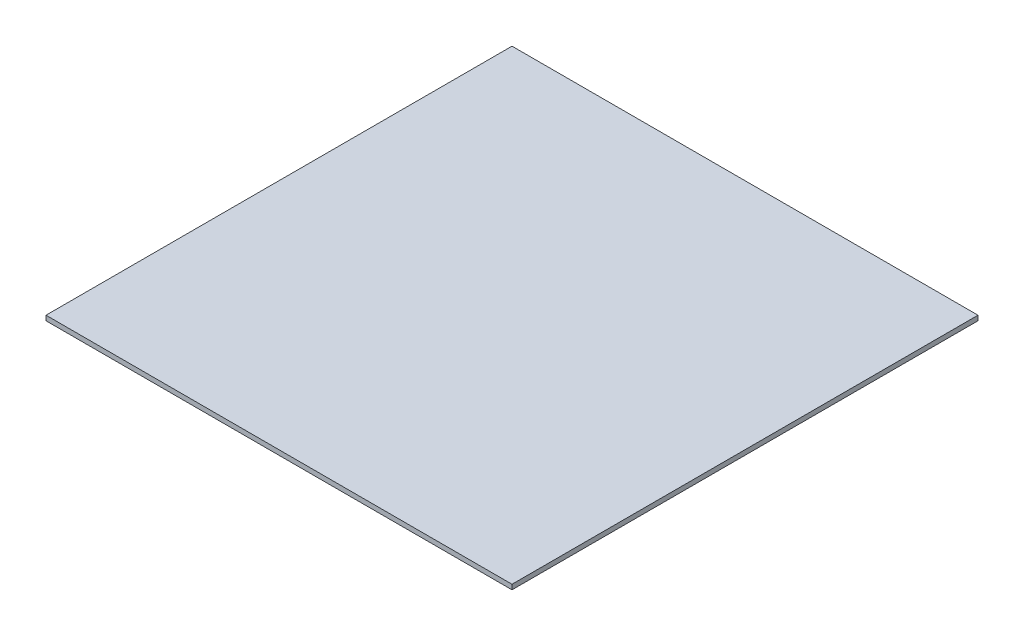
ISO-10303-21;
HEADER;
FILE_DESCRIPTION(('STEP AP214'),'2;1');
FILE_NAME('part.step','',(''),(''),'','','');
FILE_SCHEMA(('AUTOMOTIVE_DESIGN { 1 0 10303 214 1 1 1 1 }'));
ENDSEC;
DATA;
#1=APPLICATION_CONTEXT('core data for automotive mechanical design processes');
#2=APPLICATION_PROTOCOL_DEFINITION('international standard','automotive_design',2000,#1);
#3=PRODUCT_CONTEXT('',#1,'mechanical');
#4=PRODUCT('Part','Part','',(#3));
#5=PRODUCT_RELATED_PRODUCT_CATEGORY('part','',(#4));
#6=PRODUCT_DEFINITION_FORMATION('','',#4);
#7=PRODUCT_DEFINITION_CONTEXT('part definition',#1,'design');
#8=PRODUCT_DEFINITION('design','',#6,#7);
#9=PRODUCT_DEFINITION_SHAPE('','',#8);
#10=(LENGTH_UNIT() NAMED_UNIT(*) SI_UNIT(.MILLI.,.METRE.));
#11=(NAMED_UNIT(*) PLANE_ANGLE_UNIT() SI_UNIT($,.RADIAN.));
#12=(NAMED_UNIT(*) SI_UNIT($,.STERADIAN.) SOLID_ANGLE_UNIT());
#13=UNCERTAINTY_MEASURE_WITH_UNIT(LENGTH_MEASURE(1.E-05),#10,'distance_accuracy_value','');
#14=(GEOMETRIC_REPRESENTATION_CONTEXT(3) GLOBAL_UNCERTAINTY_ASSIGNED_CONTEXT((#13)) GLOBAL_UNIT_ASSIGNED_CONTEXT((#10,
#11,#12)) REPRESENTATION_CONTEXT('',''));
#15=CARTESIAN_POINT('',(0.,0.,0.));
#16=DIRECTION('',(0.,0.,1.));
#17=DIRECTION('',(1.,0.,0.));
#18=AXIS2_PLACEMENT_3D('',#15,#16,#17);
#19=CARTESIAN_POINT('',(609.6,12.7,-609.6));
#20=DIRECTION('',(1.,0.,0.));
#21=DIRECTION('',(0.,0.,-1.));
#22=AXIS2_PLACEMENT_3D('',#19,#20,#21);
#23=PLANE('',#22);
#24=DIRECTION('',(0.,0.,1.));
#25=VECTOR('',#24,1.);
#26=CARTESIAN_POINT('',(609.6,0.,-609.6));
#27=LINE('',#26,#25);
#28=CARTESIAN_POINT('',(609.6,0.,-609.6));
#29=VERTEX_POINT('',#28);
#30=CARTESIAN_POINT('',(609.6,0.,609.6));
#31=VERTEX_POINT('',#30);
#32=EDGE_CURVE('E98',#29,#31,#27,.T.);
#33=ORIENTED_EDGE('',*,*,#32,.F.);
#34=DIRECTION('',(0.,-1.,0.));
#35=VECTOR('',#34,1.);
#36=CARTESIAN_POINT('',(609.6,12.7,-609.6));
#37=LINE('',#36,#35);
#38=CARTESIAN_POINT('',(609.6,12.7,-609.6));
#39=VERTEX_POINT('',#38);
#40=EDGE_CURVE('E11',#39,#29,#37,.T.);
#41=ORIENTED_EDGE('',*,*,#40,.F.);
#42=DIRECTION('',(0.,0.,1.));
#43=VECTOR('',#42,1.);
#44=CARTESIAN_POINT('',(609.6,12.7,-609.6));
#45=LINE('',#44,#43);
#46=CARTESIAN_POINT('',(609.6,12.7,609.6));
#47=VERTEX_POINT('',#46);
#48=EDGE_CURVE('E93',#39,#47,#45,.T.);
#49=ORIENTED_EDGE('',*,*,#48,.T.);
#50=DIRECTION('',(0.,-1.,0.));
#51=VECTOR('',#50,1.);
#52=CARTESIAN_POINT('',(609.6,12.7,609.6));
#53=LINE('',#52,#51);
#54=EDGE_CURVE('E36',#47,#31,#53,.T.);
#55=ORIENTED_EDGE('',*,*,#54,.T.);
#56=EDGE_LOOP('',(#33,#41,#49,#55));
#57=FACE_BOUND('',#56,.T.);
#58=ADVANCED_FACE('F33',(#57),#23,.T.);
#59=CARTESIAN_POINT('',(609.6,12.7,-609.6));
#60=DIRECTION('',(0.,0.,1.));
#61=DIRECTION('',(1.,0.,0.));
#62=AXIS2_PLACEMENT_3D('',#59,#60,#61);
#63=PLANE('',#62);
#64=DIRECTION('',(-1.,0.,0.));
#65=VECTOR('',#64,1.);
#66=CARTESIAN_POINT('',(609.6,0.,-609.6));
#67=LINE('',#66,#65);
#68=CARTESIAN_POINT('',(-609.6,0.,-609.6));
#69=VERTEX_POINT('',#68);
#70=EDGE_CURVE('E66',#29,#69,#67,.T.);
#71=ORIENTED_EDGE('',*,*,#70,.T.);
#72=DIRECTION('',(0.,-1.,0.));
#73=VECTOR('',#72,1.);
#74=CARTESIAN_POINT('',(-609.6,12.7,-609.6));
#75=LINE('',#74,#73);
#76=CARTESIAN_POINT('',(-609.6,12.7,-609.6));
#77=VERTEX_POINT('',#76);
#78=EDGE_CURVE('E42',#77,#69,#75,.T.);
#79=ORIENTED_EDGE('',*,*,#78,.F.);
#80=DIRECTION('',(-1.,0.,0.));
#81=VECTOR('',#80,1.);
#82=CARTESIAN_POINT('',(609.6,12.7,-609.6));
#83=LINE('',#82,#81);
#84=EDGE_CURVE('E83',#39,#77,#83,.T.);
#85=ORIENTED_EDGE('',*,*,#84,.F.);
#86=ORIENTED_EDGE('',*,*,#40,.T.);
#87=EDGE_LOOP('',(#71,#79,#85,#86));
#88=FACE_BOUND('',#87,.T.);
#89=ADVANCED_FACE('F108',(#88),#63,.F.);
#90=CARTESIAN_POINT('',(-609.6,12.7,-609.6));
#91=DIRECTION('',(1.,0.,0.));
#92=DIRECTION('',(0.,0.,-1.));
#93=AXIS2_PLACEMENT_3D('',#90,#91,#92);
#94=PLANE('',#93);
#95=DIRECTION('',(0.,0.,1.));
#96=VECTOR('',#95,1.);
#97=CARTESIAN_POINT('',(-609.6,0.,-609.6));
#98=LINE('',#97,#96);
#99=CARTESIAN_POINT('',(-609.6,0.,609.6));
#100=VERTEX_POINT('',#99);
#101=EDGE_CURVE('E90',#69,#100,#98,.T.);
#102=ORIENTED_EDGE('',*,*,#101,.T.);
#103=DIRECTION('',(0.,-1.,0.));
#104=VECTOR('',#103,1.);
#105=CARTESIAN_POINT('',(-609.6,12.7,609.6));
#106=LINE('',#105,#104);
#107=CARTESIAN_POINT('',(-609.6,12.7,609.6));
#108=VERTEX_POINT('',#107);
#109=EDGE_CURVE('E87',#108,#100,#106,.T.);
#110=ORIENTED_EDGE('',*,*,#109,.F.);
#111=DIRECTION('',(0.,0.,1.));
#112=VECTOR('',#111,1.);
#113=CARTESIAN_POINT('',(-609.6,12.7,-609.6));
#114=LINE('',#113,#112);
#115=EDGE_CURVE('E78',#77,#108,#114,.T.);
#116=ORIENTED_EDGE('',*,*,#115,.F.);
#117=ORIENTED_EDGE('',*,*,#78,.T.);
#118=EDGE_LOOP('',(#102,#110,#116,#117));
#119=FACE_BOUND('',#118,.T.);
#120=ADVANCED_FACE('F88',(#119),#94,.F.);
#121=CARTESIAN_POINT('',(609.6,12.7,609.6));
#122=DIRECTION('',(0.,0.,1.));
#123=DIRECTION('',(1.,0.,0.));
#124=AXIS2_PLACEMENT_3D('',#121,#122,#123);
#125=PLANE('',#124);
#126=DIRECTION('',(-1.,0.,0.));
#127=VECTOR('',#126,1.);
#128=CARTESIAN_POINT('',(609.6,0.,609.6));
#129=LINE('',#128,#127);
#130=EDGE_CURVE('E101',#31,#100,#129,.T.);
#131=ORIENTED_EDGE('',*,*,#130,.F.);
#132=ORIENTED_EDGE('',*,*,#54,.F.);
#133=DIRECTION('',(-1.,0.,0.));
#134=VECTOR('',#133,1.);
#135=CARTESIAN_POINT('',(609.6,12.7,609.6));
#136=LINE('',#135,#134);
#137=EDGE_CURVE('E82',#47,#108,#136,.T.);
#138=ORIENTED_EDGE('',*,*,#137,.T.);
#139=ORIENTED_EDGE('',*,*,#109,.T.);
#140=EDGE_LOOP('',(#131,#132,#138,#139));
#141=FACE_BOUND('',#140,.T.);
#142=ADVANCED_FACE('F92',(#141),#125,.T.);
#143=CARTESIAN_POINT('',(0.,12.7,0.));
#144=DIRECTION('',(0.,-1.,0.));
#145=DIRECTION('',(0.,0.,-1.));
#146=AXIS2_PLACEMENT_3D('',#143,#144,#145);
#147=PLANE('',#146);
#148=ORIENTED_EDGE('',*,*,#48,.F.);
#149=ORIENTED_EDGE('',*,*,#84,.T.);
#150=ORIENTED_EDGE('',*,*,#115,.T.);
#151=ORIENTED_EDGE('',*,*,#137,.F.);
#152=EDGE_LOOP('',(#148,#149,#150,#151));
#153=FACE_BOUND('',#152,.T.);
#154=ADVANCED_FACE('F81',(#153),#147,.F.);
#155=CARTESIAN_POINT('',(0.,0.,0.));
#156=DIRECTION('',(0.,-1.,0.));
#157=DIRECTION('',(0.,0.,-1.));
#158=AXIS2_PLACEMENT_3D('',#155,#156,#157);
#159=PLANE('',#158);
#160=ORIENTED_EDGE('',*,*,#32,.T.);
#161=ORIENTED_EDGE('',*,*,#130,.T.);
#162=ORIENTED_EDGE('',*,*,#101,.F.);
#163=ORIENTED_EDGE('',*,*,#70,.F.);
#164=EDGE_LOOP('',(#160,#161,#162,#163));
#165=FACE_BOUND('',#164,.T.);
#166=ADVANCED_FACE('F106',(#165),#159,.T.);
#167=CLOSED_SHELL('',(#58,#89,#120,#142,#154,#166));
#168=MANIFOLD_SOLID_BREP('B2',#167);
#169=ADVANCED_BREP_SHAPE_REPRESENTATION('',(#18,#168),#14);
#170=SHAPE_DEFINITION_REPRESENTATION(#9,#169);
ENDSEC;
END-ISO-10303-21;
